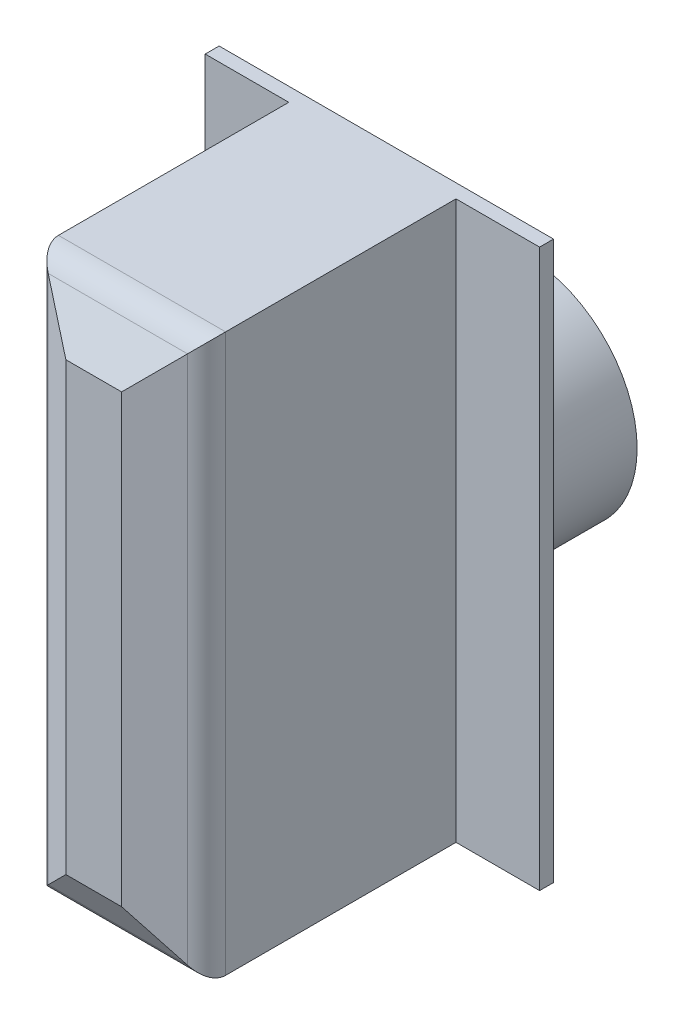
ISO-10303-21;
HEADER;
FILE_DESCRIPTION(('STEP AP214'),'2;1');
FILE_NAME('part.step','',(''),(''),'','','');
FILE_SCHEMA(('AUTOMOTIVE_DESIGN { 1 0 10303 214 1 1 1 1 }'));
ENDSEC;
DATA;
#1=APPLICATION_CONTEXT('core data for automotive mechanical design processes');
#2=APPLICATION_PROTOCOL_DEFINITION('international standard','automotive_design',2000,#1);
#3=PRODUCT_CONTEXT('',#1,'mechanical');
#4=PRODUCT('Part','Part','',(#3));
#5=PRODUCT_RELATED_PRODUCT_CATEGORY('part','',(#4));
#6=PRODUCT_DEFINITION_FORMATION('','',#4);
#7=PRODUCT_DEFINITION_CONTEXT('part definition',#1,'design');
#8=PRODUCT_DEFINITION('design','',#6,#7);
#9=PRODUCT_DEFINITION_SHAPE('','',#8);
#10=(LENGTH_UNIT() NAMED_UNIT(*) SI_UNIT(.MILLI.,.METRE.));
#11=(NAMED_UNIT(*) PLANE_ANGLE_UNIT() SI_UNIT($,.RADIAN.));
#12=(NAMED_UNIT(*) SI_UNIT($,.STERADIAN.) SOLID_ANGLE_UNIT());
#13=UNCERTAINTY_MEASURE_WITH_UNIT(LENGTH_MEASURE(1.E-05),#10,'distance_accuracy_value','');
#14=(GEOMETRIC_REPRESENTATION_CONTEXT(3) GLOBAL_UNCERTAINTY_ASSIGNED_CONTEXT((#13)) GLOBAL_UNIT_ASSIGNED_CONTEXT((#10,
#11,#12)) REPRESENTATION_CONTEXT('',''));
#15=CARTESIAN_POINT('',(0.,0.,0.));
#16=DIRECTION('',(0.,0.,1.));
#17=DIRECTION('',(1.,0.,0.));
#18=AXIS2_PLACEMENT_3D('',#15,#16,#17);
#19=CARTESIAN_POINT('',(0.,10.,1.75));
#20=DIRECTION('',(0.,0.,-1.));
#21=DIRECTION('',(-1.,0.,0.));
#22=AXIS2_PLACEMENT_3D('',#19,#20,#21);
#23=PLANE('',#22);
#24=DIRECTION('',(1.,0.,0.));
#25=VECTOR('',#24,1.);
#26=CARTESIAN_POINT('',(0.,0.,1.75));
#27=LINE('',#26,#25);
#28=CARTESIAN_POINT('',(-1.5,0.,1.75));
#29=VERTEX_POINT('',#28);
#30=CARTESIAN_POINT('',(0.,0.,1.75));
#31=VERTEX_POINT('',#30);
#32=EDGE_CURVE('E165',#29,#31,#27,.T.);
#33=ORIENTED_EDGE('',*,*,#32,.T.);
#34=DIRECTION('',(0.,-1.,0.));
#35=VECTOR('',#34,1.);
#36=CARTESIAN_POINT('',(0.,10.,1.75));
#37=LINE('',#36,#35);
#38=CARTESIAN_POINT('',(0.,10.,1.75));
#39=VERTEX_POINT('',#38);
#40=EDGE_CURVE('E146',#39,#31,#37,.T.);
#41=ORIENTED_EDGE('',*,*,#40,.F.);
#42=DIRECTION('',(1.,0.,0.));
#43=VECTOR('',#42,1.);
#44=CARTESIAN_POINT('',(0.,10.,1.75));
#45=LINE('',#44,#43);
#46=CARTESIAN_POINT('',(-1.5,10.,1.75));
#47=VERTEX_POINT('',#46);
#48=EDGE_CURVE('E153',#47,#39,#45,.T.);
#49=ORIENTED_EDGE('',*,*,#48,.F.);
#50=DIRECTION('',(0.,-1.,0.));
#51=VECTOR('',#50,1.);
#52=CARTESIAN_POINT('',(-1.5,10.,1.75));
#53=LINE('',#52,#51);
#54=EDGE_CURVE('E255',#47,#29,#53,.T.);
#55=ORIENTED_EDGE('',*,*,#54,.T.);
#56=EDGE_LOOP('',(#33,#41,#49,#55));
#57=FACE_BOUND('',#56,.T.);
#58=ADVANCED_FACE('F49',(#57),#23,.F.);
#59=CARTESIAN_POINT('',(0.,10.,1.5));
#60=DIRECTION('',(-1.,0.,0.));
#61=DIRECTION('',(0.,0.,1.));
#62=AXIS2_PLACEMENT_3D('',#59,#60,#61);
#63=PLANE('',#62);
#64=DIRECTION('',(0.,0.,-1.));
#65=VECTOR('',#64,1.);
#66=CARTESIAN_POINT('',(0.,0.,1.5));
#67=LINE('',#66,#65);
#68=CARTESIAN_POINT('',(0.,0.,1.5));
#69=VERTEX_POINT('',#68);
#70=EDGE_CURVE('E271',#31,#69,#67,.T.);
#71=ORIENTED_EDGE('',*,*,#70,.T.);
#72=DIRECTION('',(0.,-1.,0.));
#73=VECTOR('',#72,1.);
#74=CARTESIAN_POINT('',(0.,10.,1.5));
#75=LINE('',#74,#73);
#76=CARTESIAN_POINT('',(0.,10.,1.5));
#77=VERTEX_POINT('',#76);
#78=EDGE_CURVE('E149',#77,#69,#75,.T.);
#79=ORIENTED_EDGE('',*,*,#78,.F.);
#80=DIRECTION('',(0.,0.,-1.));
#81=VECTOR('',#80,1.);
#82=CARTESIAN_POINT('',(0.,10.,1.5));
#83=LINE('',#82,#81);
#84=EDGE_CURVE('E142',#39,#77,#83,.T.);
#85=ORIENTED_EDGE('',*,*,#84,.F.);
#86=ORIENTED_EDGE('',*,*,#40,.T.);
#87=EDGE_LOOP('',(#71,#79,#85,#86));
#88=FACE_BOUND('',#87,.T.);
#89=ADVANCED_FACE('F144',(#88),#63,.F.);
#90=CARTESIAN_POINT('',(0.,10.,1.5));
#91=DIRECTION('',(0.,0.,1.));
#92=DIRECTION('',(1.,0.,0.));
#93=AXIS2_PLACEMENT_3D('',#90,#91,#92);
#94=PLANE('',#93);
#95=CARTESIAN_POINT('',(-3.,5.,1.5));
#96=DIRECTION('',(0.,0.,1.));
#97=DIRECTION('',(1.,0.,0.));
#98=AXIS2_PLACEMENT_3D('',#95,#96,#97);
#99=CIRCLE('',#98,2.);
#100=CARTESIAN_POINT('',(-1.,5.,1.5));
#101=VERTEX_POINT('',#100);
#102=EDGE_CURVE('E11',#101,#101,#99,.F.);
#103=ORIENTED_EDGE('',*,*,#102,.F.);
#104=EDGE_LOOP('',(#103));
#105=FACE_BOUND('',#104,.T.);
#106=DIRECTION('',(-1.,0.,0.));
#107=VECTOR('',#106,1.);
#108=CARTESIAN_POINT('',(0.,0.,1.5));
#109=LINE('',#108,#107);
#110=CARTESIAN_POINT('',(-6.,0.,1.5));
#111=VERTEX_POINT('',#110);
#112=EDGE_CURVE('E270',#69,#111,#109,.T.);
#113=ORIENTED_EDGE('',*,*,#112,.T.);
#114=DIRECTION('',(0.,-1.,0.));
#115=VECTOR('',#114,1.);
#116=CARTESIAN_POINT('',(-6.,10.,1.5));
#117=LINE('',#116,#115);
#118=CARTESIAN_POINT('',(-6.,10.,1.5));
#119=VERTEX_POINT('',#118);
#120=EDGE_CURVE('E171',#119,#111,#117,.T.);
#121=ORIENTED_EDGE('',*,*,#120,.F.);
#122=DIRECTION('',(-1.,0.,0.));
#123=VECTOR('',#122,1.);
#124=CARTESIAN_POINT('',(0.,10.,1.5));
#125=LINE('',#124,#123);
#126=EDGE_CURVE('E152',#77,#119,#125,.T.);
#127=ORIENTED_EDGE('',*,*,#126,.F.);
#128=ORIENTED_EDGE('',*,*,#78,.T.);
#129=EDGE_LOOP('',(#113,#121,#127,#128));
#130=FACE_BOUND('',#129,.T.);
#131=ADVANCED_FACE('F315',(#105,#130),#94,.F.);
#132=CARTESIAN_POINT('',(-6.,10.,1.75));
#133=DIRECTION('',(1.,0.,0.));
#134=DIRECTION('',(0.,0.,-1.));
#135=AXIS2_PLACEMENT_3D('',#132,#133,#134);
#136=PLANE('',#135);
#137=DIRECTION('',(0.,0.,1.));
#138=VECTOR('',#137,1.);
#139=CARTESIAN_POINT('',(-6.,0.,1.75));
#140=LINE('',#139,#138);
#141=CARTESIAN_POINT('',(-6.,0.,1.75));
#142=VERTEX_POINT('',#141);
#143=EDGE_CURVE('E251',#111,#142,#140,.T.);
#144=ORIENTED_EDGE('',*,*,#143,.T.);
#145=DIRECTION('',(0.,-1.,0.));
#146=VECTOR('',#145,1.);
#147=CARTESIAN_POINT('',(-6.,10.,1.75));
#148=LINE('',#147,#146);
#149=CARTESIAN_POINT('',(-6.,10.,1.75));
#150=VERTEX_POINT('',#149);
#151=EDGE_CURVE('E258',#150,#142,#148,.T.);
#152=ORIENTED_EDGE('',*,*,#151,.F.);
#153=DIRECTION('',(0.,0.,1.));
#154=VECTOR('',#153,1.);
#155=CARTESIAN_POINT('',(-6.,10.,1.75));
#156=LINE('',#155,#154);
#157=EDGE_CURVE('E267',#119,#150,#156,.T.);
#158=ORIENTED_EDGE('',*,*,#157,.F.);
#159=ORIENTED_EDGE('',*,*,#120,.T.);
#160=EDGE_LOOP('',(#144,#152,#158,#159));
#161=FACE_BOUND('',#160,.T.);
#162=ADVANCED_FACE('F265',(#161),#136,.F.);
#163=CARTESIAN_POINT('',(-4.5,10.,1.75));
#164=DIRECTION('',(0.,0.,-1.));
#165=DIRECTION('',(-1.,0.,0.));
#166=AXIS2_PLACEMENT_3D('',#163,#164,#165);
#167=PLANE('',#166);
#168=DIRECTION('',(1.,0.,0.));
#169=VECTOR('',#168,1.);
#170=CARTESIAN_POINT('',(-4.5,0.,1.75));
#171=LINE('',#170,#169);
#172=CARTESIAN_POINT('',(-4.5,0.,1.75));
#173=VERTEX_POINT('',#172);
#174=EDGE_CURVE('E248',#142,#173,#171,.T.);
#175=ORIENTED_EDGE('',*,*,#174,.T.);
#176=DIRECTION('',(0.,-1.,0.));
#177=VECTOR('',#176,1.);
#178=CARTESIAN_POINT('',(-4.5,10.,1.75));
#179=LINE('',#178,#177);
#180=CARTESIAN_POINT('',(-4.5,10.,1.75));
#181=VERTEX_POINT('',#180);
#182=EDGE_CURVE('E247',#181,#173,#179,.T.);
#183=ORIENTED_EDGE('',*,*,#182,.F.);
#184=DIRECTION('',(1.,0.,0.));
#185=VECTOR('',#184,1.);
#186=CARTESIAN_POINT('',(-4.5,10.,1.75));
#187=LINE('',#186,#185);
#188=EDGE_CURVE('E279',#150,#181,#187,.T.);
#189=ORIENTED_EDGE('',*,*,#188,.F.);
#190=ORIENTED_EDGE('',*,*,#151,.T.);
#191=EDGE_LOOP('',(#175,#183,#189,#190));
#192=FACE_BOUND('',#191,.T.);
#193=ADVANCED_FACE('F402',(#192),#167,.F.);
#194=CARTESIAN_POINT('',(-4.5,10.,1.75));
#195=DIRECTION('',(1.,0.,0.));
#196=DIRECTION('',(0.,0.,-1.));
#197=AXIS2_PLACEMENT_3D('',#194,#195,#196);
#198=PLANE('',#197);
#199=DIRECTION('',(0.,0.,1.));
#200=VECTOR('',#199,1.);
#201=CARTESIAN_POINT('',(-4.5,0.,1.75));
#202=LINE('',#201,#200);
#203=CARTESIAN_POINT('',(-4.5,0.,5.88397459621556));
#204=VERTEX_POINT('',#203);
#205=EDGE_CURVE('E243',#173,#204,#202,.T.);
#206=ORIENTED_EDGE('',*,*,#205,.T.);
#207=DIRECTION('',(0.,-1.,0.));
#208=VECTOR('',#207,1.);
#209=CARTESIAN_POINT('',(-4.5,10.,5.88397459621556));
#210=LINE('',#209,#208);
#211=CARTESIAN_POINT('',(-4.5,10.,5.88397459621556));
#212=VERTEX_POINT('',#211);
#213=EDGE_CURVE('E72',#204,#212,#210,.F.);
#214=ORIENTED_EDGE('',*,*,#213,.T.);
#215=DIRECTION('',(0.,0.,1.));
#216=VECTOR('',#215,1.);
#217=CARTESIAN_POINT('',(-4.5,10.,1.75));
#218=LINE('',#217,#216);
#219=EDGE_CURVE('E277',#181,#212,#218,.T.);
#220=ORIENTED_EDGE('',*,*,#219,.F.);
#221=ORIENTED_EDGE('',*,*,#182,.T.);
#222=EDGE_LOOP('',(#206,#214,#220,#221));
#223=FACE_BOUND('',#222,.T.);
#224=ADVANCED_FACE('F245',(#223),#198,.F.);
#225=CARTESIAN_POINT('',(-1.5,10.,6.75));
#226=DIRECTION('',(0.,0.,-1.));
#227=DIRECTION('',(-1.,0.,0.));
#228=AXIS2_PLACEMENT_3D('',#225,#226,#227);
#229=PLANE('',#228);
#230=DIRECTION('',(-1.,0.,0.));
#231=VECTOR('',#230,1.);
#232=CARTESIAN_POINT('',(-4.5,9.,6.75));
#233=LINE('',#232,#231);
#234=CARTESIAN_POINT('',(-2.5,9.,6.75));
#235=VERTEX_POINT('',#234);
#236=CARTESIAN_POINT('',(-3.5,9.,6.75));
#237=VERTEX_POINT('',#236);
#238=EDGE_CURVE('E176',#235,#237,#233,.T.);
#239=ORIENTED_EDGE('',*,*,#238,.T.);
#240=DIRECTION('',(0.,-1.,0.));
#241=VECTOR('',#240,1.);
#242=CARTESIAN_POINT('',(-3.5,10.,6.75));
#243=LINE('',#242,#241);
#244=CARTESIAN_POINT('',(-3.5,1.,6.75));
#245=VERTEX_POINT('',#244);
#246=EDGE_CURVE('E178',#237,#245,#243,.T.);
#247=ORIENTED_EDGE('',*,*,#246,.T.);
#248=DIRECTION('',(1.,0.,0.));
#249=VECTOR('',#248,1.);
#250=CARTESIAN_POINT('',(-1.5,1.,6.75));
#251=LINE('',#250,#249);
#252=CARTESIAN_POINT('',(-2.5,1.,6.75));
#253=VERTEX_POINT('',#252);
#254=EDGE_CURVE('E166',#245,#253,#251,.T.);
#255=ORIENTED_EDGE('',*,*,#254,.T.);
#256=DIRECTION('',(0.,1.,0.));
#257=VECTOR('',#256,1.);
#258=CARTESIAN_POINT('',(-2.5,10.,6.75));
#259=LINE('',#258,#257);
#260=EDGE_CURVE('E169',#253,#235,#259,.T.);
#261=ORIENTED_EDGE('',*,*,#260,.T.);
#262=EDGE_LOOP('',(#239,#247,#255,#261));
#263=FACE_BOUND('',#262,.T.);
#264=ADVANCED_FACE('F391',(#263),#229,.F.);
#265=CARTESIAN_POINT('',(-1.5,10.,1.75));
#266=DIRECTION('',(-1.,0.,0.));
#267=DIRECTION('',(0.,0.,1.));
#268=AXIS2_PLACEMENT_3D('',#265,#266,#267);
#269=PLANE('',#268);
#270=DIRECTION('',(0.,0.,-1.));
#271=VECTOR('',#270,1.);
#272=CARTESIAN_POINT('',(-1.5,10.,1.75));
#273=LINE('',#272,#271);
#274=CARTESIAN_POINT('',(-1.5,10.,5.88397459621556));
#275=VERTEX_POINT('',#274);
#276=EDGE_CURVE('E158',#275,#47,#273,.T.);
#277=ORIENTED_EDGE('',*,*,#276,.F.);
#278=DIRECTION('',(0.,1.,0.));
#279=VECTOR('',#278,1.);
#280=CARTESIAN_POINT('',(-1.5,0.,5.88397459621556));
#281=LINE('',#280,#279);
#282=CARTESIAN_POINT('',(-1.5,0.,5.88397459621556));
#283=VERTEX_POINT('',#282);
#284=EDGE_CURVE('E196',#275,#283,#281,.F.);
#285=ORIENTED_EDGE('',*,*,#284,.T.);
#286=DIRECTION('',(0.,0.,-1.));
#287=VECTOR('',#286,1.);
#288=CARTESIAN_POINT('',(-1.5,0.,1.75));
#289=LINE('',#288,#287);
#290=EDGE_CURVE('E162',#283,#29,#289,.T.);
#291=ORIENTED_EDGE('',*,*,#290,.T.);
#292=ORIENTED_EDGE('',*,*,#54,.F.);
#293=EDGE_LOOP('',(#277,#285,#291,#292));
#294=FACE_BOUND('',#293,.T.);
#295=ADVANCED_FACE('F383',(#294),#269,.F.);
#296=CARTESIAN_POINT('',(0.,10.,0.));
#297=DIRECTION('',(0.,1.,0.));
#298=DIRECTION('',(0.,0.,1.));
#299=AXIS2_PLACEMENT_3D('',#296,#297,#298);
#300=PLANE('',#299);
#301=ORIENTED_EDGE('',*,*,#219,.T.);
#302=DIRECTION('',(1.,0.,0.));
#303=VECTOR('',#302,1.);
#304=CARTESIAN_POINT('',(0.,10.,5.88397459621556));
#305=LINE('',#304,#303);
#306=EDGE_CURVE('E200',#212,#275,#305,.T.);
#307=ORIENTED_EDGE('',*,*,#306,.T.);
#308=ORIENTED_EDGE('',*,*,#276,.T.);
#309=ORIENTED_EDGE('',*,*,#48,.T.);
#310=ORIENTED_EDGE('',*,*,#84,.T.);
#311=ORIENTED_EDGE('',*,*,#126,.T.);
#312=ORIENTED_EDGE('',*,*,#157,.T.);
#313=ORIENTED_EDGE('',*,*,#188,.T.);
#314=EDGE_LOOP('',(#301,#307,#308,#309,#310,#311,#312,#313));
#315=FACE_BOUND('',#314,.T.);
#316=ADVANCED_FACE('F156',(#315),#300,.T.);
#317=CARTESIAN_POINT('',(0.,0.,0.));
#318=DIRECTION('',(0.,1.,0.));
#319=DIRECTION('',(0.,0.,1.));
#320=AXIS2_PLACEMENT_3D('',#317,#318,#319);
#321=PLANE('',#320);
#322=ORIENTED_EDGE('',*,*,#290,.F.);
#323=DIRECTION('',(1.,0.,0.));
#324=VECTOR('',#323,1.);
#325=CARTESIAN_POINT('',(-4.5,0.,5.88397459621556));
#326=LINE('',#325,#324);
#327=EDGE_CURVE('E181',#283,#204,#326,.F.);
#328=ORIENTED_EDGE('',*,*,#327,.T.);
#329=ORIENTED_EDGE('',*,*,#205,.F.);
#330=ORIENTED_EDGE('',*,*,#174,.F.);
#331=ORIENTED_EDGE('',*,*,#143,.F.);
#332=ORIENTED_EDGE('',*,*,#112,.F.);
#333=ORIENTED_EDGE('',*,*,#70,.F.);
#334=ORIENTED_EDGE('',*,*,#32,.F.);
#335=EDGE_LOOP('',(#322,#328,#329,#330,#331,#332,#333,#334));
#336=FACE_BOUND('',#335,.T.);
#337=ADVANCED_FACE('F241',(#336),#321,.F.);
#338=CARTESIAN_POINT('',(-1.5,10.,6.17264973081037));
#339=DIRECTION('',(-0.499999999999998,0.,-0.86602540378444));
#340=DIRECTION('',(0.,-1.,0.));
#341=AXIS2_PLACEMENT_3D('',#338,#339,#340);
#342=PLANE('',#341);
#343=DIRECTION('',(-0.654653670707978,0.654653670707977,0.377964473009225));
#344=VECTOR('',#343,1.);
#345=CARTESIAN_POINT('',(-2.07142857142857,0.571428571428573,6.5025641703473));
#346=LINE('',#345,#344);
#347=CARTESIAN_POINT('',(-1.75,0.250000000000003,6.31698729810778));
#348=VERTEX_POINT('',#347);
#349=EDGE_CURVE('E187',#348,#253,#346,.T.);
#350=ORIENTED_EDGE('',*,*,#349,.F.);
#351=DIRECTION('',(0.,-1.,0.));
#352=VECTOR('',#351,1.);
#353=CARTESIAN_POINT('',(-1.75,10.,6.31698729810778));
#354=LINE('',#353,#352);
#355=CARTESIAN_POINT('',(-1.75,9.75,6.31698729810778));
#356=VERTEX_POINT('',#355);
#357=EDGE_CURVE('E198',#348,#356,#354,.F.);
#358=ORIENTED_EDGE('',*,*,#357,.T.);
#359=DIRECTION('',(0.654653670707978,0.654653670707977,-0.377964473009225));
#360=VECTOR('',#359,1.);
#361=CARTESIAN_POINT('',(-1.5,10.,6.17264973081037));
#362=LINE('',#361,#360);
#363=EDGE_CURVE('E189',#235,#356,#362,.T.);
#364=ORIENTED_EDGE('',*,*,#363,.F.);
#365=ORIENTED_EDGE('',*,*,#260,.F.);
#366=EDGE_LOOP('',(#350,#358,#364,#365));
#367=FACE_BOUND('',#366,.T.);
#368=ADVANCED_FACE('F336',(#367),#342,.F.);
#369=CARTESIAN_POINT('',(0.,10.,6.17264973081037));
#370=DIRECTION('',(0.,0.499999999999998,0.86602540378444));
#371=DIRECTION('',(-1.,0.,0.));
#372=AXIS2_PLACEMENT_3D('',#369,#370,#371);
#373=PLANE('',#372);
#374=ORIENTED_EDGE('',*,*,#363,.T.);
#375=DIRECTION('',(1.,0.,0.));
#376=VECTOR('',#375,1.);
#377=CARTESIAN_POINT('',(0.,9.75,6.31698729810778));
#378=LINE('',#377,#376);
#379=CARTESIAN_POINT('',(-4.25,9.75,6.31698729810778));
#380=VERTEX_POINT('',#379);
#381=EDGE_CURVE('E64',#356,#380,#378,.F.);
#382=ORIENTED_EDGE('',*,*,#381,.T.);
#383=DIRECTION('',(-0.654653670707978,0.654653670707977,-0.377964473009225));
#384=VECTOR('',#383,1.);
#385=CARTESIAN_POINT('',(-2.57142857142857,8.07142857142857,7.28611096424751));
#386=LINE('',#385,#384);
#387=EDGE_CURVE('E184',#237,#380,#386,.T.);
#388=ORIENTED_EDGE('',*,*,#387,.F.);
#389=ORIENTED_EDGE('',*,*,#238,.F.);
#390=EDGE_LOOP('',(#374,#382,#388,#389));
#391=FACE_BOUND('',#390,.T.);
#392=ADVANCED_FACE('F330',(#391),#373,.T.);
#393=CARTESIAN_POINT('',(-1.5,1.,6.75));
#394=DIRECTION('',(0.,0.499999999999998,-0.86602540378444));
#395=DIRECTION('',(1.,0.,0.));
#396=AXIS2_PLACEMENT_3D('',#393,#394,#395);
#397=PLANE('',#396);
#398=DIRECTION('',(-0.654653670707978,-0.654653670707977,-0.377964473009225));
#399=VECTOR('',#398,1.);
#400=CARTESIAN_POINT('',(-2.64285714285714,1.85714285714286,7.24487165930539));
#401=LINE('',#400,#399);
#402=CARTESIAN_POINT('',(-4.25,0.250000000000003,6.31698729810778));
#403=VERTEX_POINT('',#402);
#404=EDGE_CURVE('E182',#403,#245,#401,.F.);
#405=ORIENTED_EDGE('',*,*,#404,.F.);
#406=DIRECTION('',(-1.,0.,0.));
#407=VECTOR('',#406,1.);
#408=CARTESIAN_POINT('',(-1.5,0.250000000000001,6.31698729810778));
#409=LINE('',#408,#407);
#410=EDGE_CURVE('E193',#403,#348,#409,.F.);
#411=ORIENTED_EDGE('',*,*,#410,.T.);
#412=ORIENTED_EDGE('',*,*,#349,.T.);
#413=ORIENTED_EDGE('',*,*,#254,.F.);
#414=EDGE_LOOP('',(#405,#411,#412,#413));
#415=FACE_BOUND('',#414,.T.);
#416=ADVANCED_FACE('F233',(#415),#397,.F.);
#417=CARTESIAN_POINT('',(-3.5,10.,6.75));
#418=DIRECTION('',(0.499999999999998,0.,-0.86602540378444));
#419=DIRECTION('',(0.,-1.,0.));
#420=AXIS2_PLACEMENT_3D('',#417,#418,#419);
#421=PLANE('',#420);
#422=ORIENTED_EDGE('',*,*,#387,.T.);
#423=DIRECTION('',(0.,1.,0.));
#424=VECTOR('',#423,1.);
#425=CARTESIAN_POINT('',(-4.25,0.,6.31698729810778));
#426=LINE('',#425,#424);
#427=EDGE_CURVE('E57',#380,#403,#426,.F.);
#428=ORIENTED_EDGE('',*,*,#427,.T.);
#429=ORIENTED_EDGE('',*,*,#404,.T.);
#430=ORIENTED_EDGE('',*,*,#246,.F.);
#431=EDGE_LOOP('',(#422,#428,#429,#430));
#432=FACE_BOUND('',#431,.T.);
#433=ADVANCED_FACE('F228',(#432),#421,.F.);
#434=CARTESIAN_POINT('',(0.,9.5,5.88397459621556));
#435=DIRECTION('',(1.,0.,0.));
#436=DIRECTION('',(0.,0.,-1.));
#437=AXIS2_PLACEMENT_3D('',#434,#435,#436);
#438=CYLINDRICAL_SURFACE('',#437,0.5);
#439=CARTESIAN_POINT('',(-4.,9.5,5.88397459621556));
#440=DIRECTION('',(0.707106781186547,0.707106781186547,0.));
#441=DIRECTION('',(-0.707106781186547,0.707106781186547,0.));
#442=AXIS2_PLACEMENT_3D('',#439,#440,#441);
#443=ELLIPSE('',#442,0.707106781186547,0.5);
#444=EDGE_CURVE('E210',#380,#212,#443,.F.);
#445=ORIENTED_EDGE('',*,*,#444,.F.);
#446=ORIENTED_EDGE('',*,*,#381,.F.);
#447=CARTESIAN_POINT('',(-2.,9.5,5.88397459621556));
#448=DIRECTION('',(0.707106781186547,-0.707106781186547,0.));
#449=DIRECTION('',(0.707106781186547,0.707106781186547,0.));
#450=AXIS2_PLACEMENT_3D('',#447,#448,#449);
#451=ELLIPSE('',#450,0.707106781186547,0.5);
#452=EDGE_CURVE('E185',#275,#356,#451,.T.);
#453=ORIENTED_EDGE('',*,*,#452,.F.);
#454=ORIENTED_EDGE('',*,*,#306,.F.);
#455=EDGE_LOOP('',(#445,#446,#453,#454));
#456=FACE_BOUND('',#455,.T.);
#457=ADVANCED_FACE('F51',(#456),#438,.T.);
#458=CARTESIAN_POINT('',(-2.,10.,5.88397459621556));
#459=DIRECTION('',(0.,-1.,0.));
#460=DIRECTION('',(0.,0.,-1.));
#461=AXIS2_PLACEMENT_3D('',#458,#459,#460);
#462=CYLINDRICAL_SURFACE('',#461,0.5);
#463=ORIENTED_EDGE('',*,*,#452,.T.);
#464=ORIENTED_EDGE('',*,*,#357,.F.);
#465=CARTESIAN_POINT('',(-2.,0.5,5.88397459621556));
#466=DIRECTION('',(-0.707106781186547,-0.707106781186547,0.));
#467=DIRECTION('',(0.707106781186547,-0.707106781186547,0.));
#468=AXIS2_PLACEMENT_3D('',#465,#466,#467);
#469=ELLIPSE('',#468,0.707106781186547,0.5);
#470=EDGE_CURVE('E207',#283,#348,#469,.T.);
#471=ORIENTED_EDGE('',*,*,#470,.F.);
#472=ORIENTED_EDGE('',*,*,#284,.F.);
#473=EDGE_LOOP('',(#463,#464,#471,#472));
#474=FACE_BOUND('',#473,.T.);
#475=ADVANCED_FACE('F217',(#474),#462,.T.);
#476=CARTESIAN_POINT('',(-4.,10.,5.88397459621556));
#477=DIRECTION('',(0.,1.,0.));
#478=DIRECTION('',(0.,0.,1.));
#479=AXIS2_PLACEMENT_3D('',#476,#477,#478);
#480=CYLINDRICAL_SURFACE('',#479,0.5);
#481=ORIENTED_EDGE('',*,*,#444,.T.);
#482=ORIENTED_EDGE('',*,*,#213,.F.);
#483=CARTESIAN_POINT('',(-4.,0.5,5.88397459621556));
#484=DIRECTION('',(-0.707106781186547,0.707106781186547,0.));
#485=DIRECTION('',(0.707106781186547,0.707106781186547,0.));
#486=AXIS2_PLACEMENT_3D('',#483,#484,#485);
#487=ELLIPSE('',#486,0.707106781186547,0.5);
#488=EDGE_CURVE('E205',#403,#204,#487,.F.);
#489=ORIENTED_EDGE('',*,*,#488,.F.);
#490=ORIENTED_EDGE('',*,*,#427,.F.);
#491=EDGE_LOOP('',(#481,#482,#489,#490));
#492=FACE_BOUND('',#491,.T.);
#493=ADVANCED_FACE('F225',(#492),#480,.T.);
#494=CARTESIAN_POINT('',(0.,0.5,5.88397459621556));
#495=DIRECTION('',(-1.,0.,0.));
#496=DIRECTION('',(0.,0.,1.));
#497=AXIS2_PLACEMENT_3D('',#494,#495,#496);
#498=CYLINDRICAL_SURFACE('',#497,0.5);
#499=ORIENTED_EDGE('',*,*,#470,.T.);
#500=ORIENTED_EDGE('',*,*,#410,.F.);
#501=ORIENTED_EDGE('',*,*,#488,.T.);
#502=ORIENTED_EDGE('',*,*,#327,.F.);
#503=EDGE_LOOP('',(#499,#500,#501,#502));
#504=FACE_BOUND('',#503,.T.);
#505=ADVANCED_FACE('F236',(#504),#498,.T.);
#506=CARTESIAN_POINT('',(-3.,5.,-1.));
#507=DIRECTION('',(0.,0.,-1.));
#508=DIRECTION('',(-1.,0.,0.));
#509=AXIS2_PLACEMENT_3D('',#506,#507,#508);
#510=PLANE('',#509);
#511=CARTESIAN_POINT('',(-3.,5.,-1.));
#512=DIRECTION('',(0.,0.,-1.));
#513=DIRECTION('',(-1.,0.,0.));
#514=AXIS2_PLACEMENT_3D('',#511,#512,#513);
#515=CIRCLE('',#514,2.);
#516=CARTESIAN_POINT('',(-5.,5.,-1.));
#517=VERTEX_POINT('',#516);
#518=EDGE_CURVE('E208',#517,#517,#515,.T.);
#519=ORIENTED_EDGE('',*,*,#518,.T.);
#520=EDGE_LOOP('',(#519));
#521=FACE_BOUND('',#520,.T.);
#522=CARTESIAN_POINT('',(-3.,5.,-1.));
#523=DIRECTION('',(0.,0.,-1.));
#524=DIRECTION('',(-1.,0.,0.));
#525=AXIS2_PLACEMENT_3D('',#522,#523,#524);
#526=CIRCLE('',#525,1.75);
#527=CARTESIAN_POINT('',(-4.75,5.,-1.));
#528=VERTEX_POINT('',#527);
#529=EDGE_CURVE('E285',#528,#528,#526,.T.);
#530=ORIENTED_EDGE('',*,*,#529,.F.);
#531=EDGE_LOOP('',(#530));
#532=FACE_BOUND('',#531,.T.);
#533=ADVANCED_FACE('F295',(#521,#532),#510,.T.);
#534=CARTESIAN_POINT('',(-3.,5.,-1.));
#535=DIRECTION('',(0.,0.,1.));
#536=DIRECTION('',(1.,0.,0.));
#537=AXIS2_PLACEMENT_3D('',#534,#535,#536);
#538=CYLINDRICAL_SURFACE('',#537,2.);
#539=ORIENTED_EDGE('',*,*,#518,.F.);
#540=EDGE_LOOP('',(#539));
#541=FACE_BOUND('',#540,.T.);
#542=ORIENTED_EDGE('',*,*,#102,.T.);
#543=EDGE_LOOP('',(#542));
#544=FACE_BOUND('',#543,.T.);
#545=ADVANCED_FACE('F297',(#541,#544),#538,.T.);
#546=CARTESIAN_POINT('',(-3.,5.,-1.));
#547=DIRECTION('',(0.,0.,1.));
#548=DIRECTION('',(1.,0.,0.));
#549=AXIS2_PLACEMENT_3D('',#546,#547,#548);
#550=CYLINDRICAL_SURFACE('',#549,1.75);
#551=ORIENTED_EDGE('',*,*,#529,.T.);
#552=EDGE_LOOP('',(#551));
#553=FACE_BOUND('',#552,.T.);
#554=CARTESIAN_POINT('',(-3.,5.,1.5));
#555=DIRECTION('',(0.,0.,-1.));
#556=DIRECTION('',(-1.,0.,0.));
#557=AXIS2_PLACEMENT_3D('',#554,#555,#556);
#558=CIRCLE('',#557,1.75);
#559=CARTESIAN_POINT('',(-4.75,5.,1.5));
#560=VERTEX_POINT('',#559);
#561=EDGE_CURVE('E286',#560,#560,#558,.T.);
#562=ORIENTED_EDGE('',*,*,#561,.F.);
#563=EDGE_LOOP('',(#562));
#564=FACE_BOUND('',#563,.T.);
#565=ADVANCED_FACE('F292',(#553,#564),#550,.F.);
#566=ORIENTED_EDGE('',*,*,#561,.T.);
#567=EDGE_LOOP('',(#566));
#568=FACE_BOUND('',#567,.T.);
#569=ADVANCED_FACE('F453',(#568),#94,.F.);
#570=CLOSED_SHELL('',(#58,#89,#131,#162,#193,#224,#264,#295,#316,#337,#368,#392,#416,#433,#457,
#475,#493,#505,#533,#545,#565,#569));
#571=MANIFOLD_SOLID_BREP('B2',#570);
#572=ADVANCED_BREP_SHAPE_REPRESENTATION('',(#18,#571),#14);
#573=SHAPE_DEFINITION_REPRESENTATION(#9,#572);
ENDSEC;
END-ISO-10303-21;
